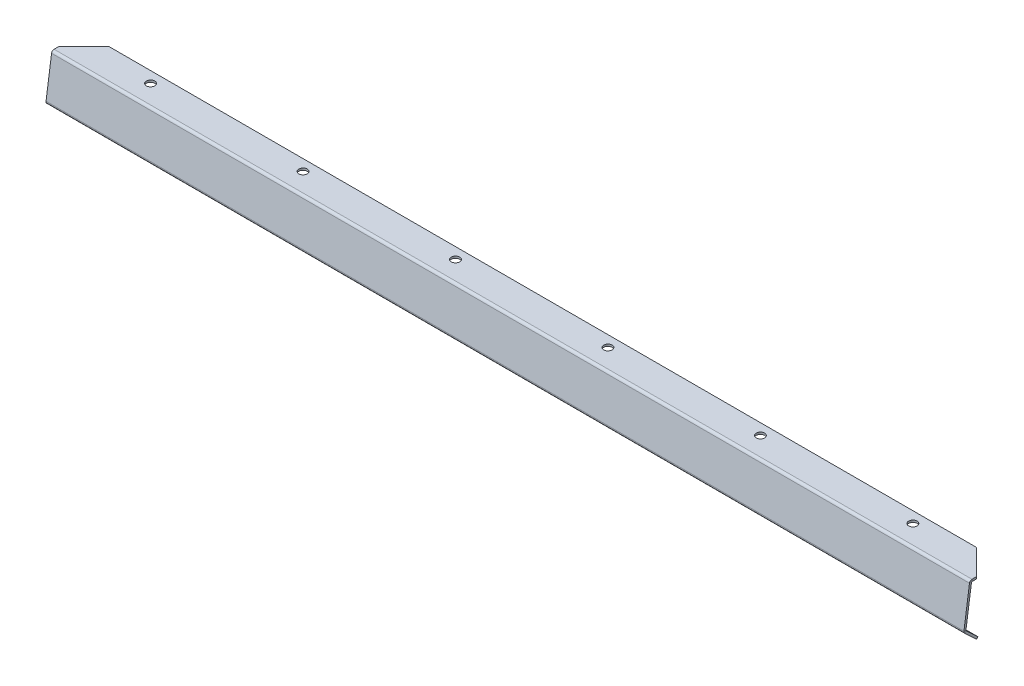
ISO-10303-21;
HEADER;
FILE_DESCRIPTION(('STEP AP214'),'2;1');
FILE_NAME('part.step','',(''),(''),'','','');
FILE_SCHEMA(('AUTOMOTIVE_DESIGN { 1 0 10303 214 1 1 1 1 }'));
ENDSEC;
DATA;
#1=APPLICATION_CONTEXT('core data for automotive mechanical design processes');
#2=APPLICATION_PROTOCOL_DEFINITION('international standard','automotive_design',2000,#1);
#3=PRODUCT_CONTEXT('',#1,'mechanical');
#4=PRODUCT('Part','Part','',(#3));
#5=PRODUCT_RELATED_PRODUCT_CATEGORY('part','',(#4));
#6=PRODUCT_DEFINITION_FORMATION('','',#4);
#7=PRODUCT_DEFINITION_CONTEXT('part definition',#1,'design');
#8=PRODUCT_DEFINITION('design','',#6,#7);
#9=PRODUCT_DEFINITION_SHAPE('','',#8);
#10=(LENGTH_UNIT() NAMED_UNIT(*) SI_UNIT(.MILLI.,.METRE.));
#11=(NAMED_UNIT(*) PLANE_ANGLE_UNIT() SI_UNIT($,.RADIAN.));
#12=(NAMED_UNIT(*) SI_UNIT($,.STERADIAN.) SOLID_ANGLE_UNIT());
#13=UNCERTAINTY_MEASURE_WITH_UNIT(LENGTH_MEASURE(1.E-05),#10,'distance_accuracy_value','');
#14=(GEOMETRIC_REPRESENTATION_CONTEXT(3) GLOBAL_UNCERTAINTY_ASSIGNED_CONTEXT((#13)) GLOBAL_UNIT_ASSIGNED_CONTEXT((#10,
#11,#12)) REPRESENTATION_CONTEXT('',''));
#15=CARTESIAN_POINT('',(0.,0.,0.));
#16=DIRECTION('',(0.,0.,1.));
#17=DIRECTION('',(1.,0.,0.));
#18=AXIS2_PLACEMENT_3D('',#15,#16,#17);
#19=CARTESIAN_POINT('',(-229.4001,0.,10.4394));
#20=DIRECTION('',(0.,1.,0.));
#21=DIRECTION('',(0.,0.,1.));
#22=AXIS2_PLACEMENT_3D('',#19,#20,#21);
#23=PLANE('',#22);
#24=CARTESIAN_POINT('',(38.1,0.,0.));
#25=DIRECTION('',(0.,1.,0.));
#26=DIRECTION('',(0.,0.,-1.));
#27=AXIS2_PLACEMENT_3D('',#24,#25,#26);
#28=CIRCLE('',#27,2.1082);
#29=CARTESIAN_POINT('',(38.1,0.,-2.1082));
#30=VERTEX_POINT('',#29);
#31=EDGE_CURVE('E254',#30,#30,#28,.T.);
#32=ORIENTED_EDGE('',*,*,#31,.F.);
#33=EDGE_LOOP('',(#32));
#34=FACE_BOUND('',#33,.T.);
#35=CARTESIAN_POINT('',(114.3,0.,5.3210206423307E-13));
#36=DIRECTION('',(0.,1.,0.));
#37=DIRECTION('',(0.,0.,-1.));
#38=AXIS2_PLACEMENT_3D('',#35,#36,#37);
#39=CIRCLE('',#38,2.1082);
#40=CARTESIAN_POINT('',(114.3,0.,-2.10819999999947));
#41=VERTEX_POINT('',#40);
#42=EDGE_CURVE('E244',#41,#41,#39,.T.);
#43=ORIENTED_EDGE('',*,*,#42,.F.);
#44=EDGE_LOOP('',(#43));
#45=FACE_BOUND('',#44,.T.);
#46=CARTESIAN_POINT('',(190.5,0.,1.06420412846614E-12));
#47=DIRECTION('',(0.,1.,0.));
#48=DIRECTION('',(0.,0.,-1.));
#49=AXIS2_PLACEMENT_3D('',#46,#47,#48);
#50=CIRCLE('',#49,2.10820000000002);
#51=CARTESIAN_POINT('',(190.5,0.,-2.10819999999895));
#52=VERTEX_POINT('',#51);
#53=EDGE_CURVE('E241',#52,#52,#50,.T.);
#54=ORIENTED_EDGE('',*,*,#53,.F.);
#55=EDGE_LOOP('',(#54));
#56=FACE_BOUND('',#55,.T.);
#57=CARTESIAN_POINT('',(-190.5,0.,1.06420412846614E-12));
#58=DIRECTION('',(0.,1.,0.));
#59=DIRECTION('',(0.,0.,1.));
#60=AXIS2_PLACEMENT_3D('',#57,#58,#59);
#61=CIRCLE('',#60,2.10820000000002);
#62=CARTESIAN_POINT('',(-190.5,0.,2.10820000000108));
#63=VERTEX_POINT('',#62);
#64=EDGE_CURVE('E238',#63,#63,#61,.T.);
#65=ORIENTED_EDGE('',*,*,#64,.F.);
#66=EDGE_LOOP('',(#65));
#67=FACE_BOUND('',#66,.T.);
#68=CARTESIAN_POINT('',(-114.3,0.,5.3210206423307E-13));
#69=DIRECTION('',(0.,1.,0.));
#70=DIRECTION('',(0.,0.,1.));
#71=AXIS2_PLACEMENT_3D('',#68,#69,#70);
#72=CIRCLE('',#71,2.1082);
#73=CARTESIAN_POINT('',(-114.3,0.,2.10820000000053));
#74=VERTEX_POINT('',#73);
#75=EDGE_CURVE('E234',#74,#74,#72,.T.);
#76=ORIENTED_EDGE('',*,*,#75,.F.);
#77=EDGE_LOOP('',(#76));
#78=FACE_BOUND('',#77,.T.);
#79=CARTESIAN_POINT('',(-38.1,0.,0.));
#80=DIRECTION('',(0.,1.,0.));
#81=DIRECTION('',(0.,0.,1.));
#82=AXIS2_PLACEMENT_3D('',#79,#80,#81);
#83=CIRCLE('',#82,2.1082);
#84=CARTESIAN_POINT('',(-38.1,0.,2.1082));
#85=VERTEX_POINT('',#84);
#86=EDGE_CURVE('E230',#85,#85,#83,.T.);
#87=ORIENTED_EDGE('',*,*,#86,.F.);
#88=EDGE_LOOP('',(#87));
#89=FACE_BOUND('',#88,.T.);
#90=DIRECTION('',(0.,0.,1.));
#91=VECTOR('',#90,1.);
#92=CARTESIAN_POINT('',(229.4001,0.,10.4394));
#93=LINE('',#92,#91);
#94=CARTESIAN_POINT('',(229.4001,0.,7.1374000000002));
#95=VERTEX_POINT('',#94);
#96=CARTESIAN_POINT('',(229.4001,0.,9.33821053030135));
#97=VERTEX_POINT('',#96);
#98=EDGE_CURVE('E161',#95,#97,#93,.T.);
#99=ORIENTED_EDGE('',*,*,#98,.F.);
#100=DIRECTION('',(0.707106781186544,0.,0.707106781186551));
#101=VECTOR('',#100,1.);
#102=CARTESIAN_POINT('',(215.810037106983,0.,-6.45266289301725));
#103=LINE('',#102,#101);
#104=CARTESIAN_POINT('',(216.7001,0.,-5.56260000000001));
#105=VERTEX_POINT('',#104);
#106=EDGE_CURVE('E56',#105,#95,#103,.T.);
#107=ORIENTED_EDGE('',*,*,#106,.F.);
#108=DIRECTION('',(1.,0.,0.));
#109=VECTOR('',#108,1.);
#110=CARTESIAN_POINT('',(-229.4001,0.,-5.5626));
#111=LINE('',#110,#109);
#112=CARTESIAN_POINT('',(-216.7001,0.,-5.5626));
#113=VERTEX_POINT('',#112);
#114=EDGE_CURVE('E193',#113,#105,#111,.T.);
#115=ORIENTED_EDGE('',*,*,#114,.F.);
#116=DIRECTION('',(0.707106781186544,0.,-0.707106781186551));
#117=VECTOR('',#116,1.);
#118=CARTESIAN_POINT('',(-215.810037106983,0.,-6.45266289301725));
#119=LINE('',#118,#117);
#120=CARTESIAN_POINT('',(-229.4001,0.,7.13740000000013));
#121=VERTEX_POINT('',#120);
#122=EDGE_CURVE('E444',#121,#113,#119,.T.);
#123=ORIENTED_EDGE('',*,*,#122,.F.);
#124=DIRECTION('',(0.,0.,1.));
#125=VECTOR('',#124,1.);
#126=CARTESIAN_POINT('',(-229.4001,0.,10.4394));
#127=LINE('',#126,#125);
#128=CARTESIAN_POINT('',(-229.4001,0.,9.33821053030135));
#129=VERTEX_POINT('',#128);
#130=EDGE_CURVE('E281',#121,#129,#127,.T.);
#131=ORIENTED_EDGE('',*,*,#130,.T.);
#132=DIRECTION('',(1.,0.,0.));
#133=VECTOR('',#132,1.);
#134=CARTESIAN_POINT('',(-229.4001,0.,9.33821053030135));
#135=LINE('',#134,#133);
#136=EDGE_CURVE('E190',#129,#97,#135,.T.);
#137=ORIENTED_EDGE('',*,*,#136,.T.);
#138=EDGE_LOOP('',(#99,#107,#115,#123,#131,#137));
#139=FACE_BOUND('',#138,.T.);
#140=ADVANCED_FACE('F39',(#34,#45,#56,#67,#78,#89,#139),#23,.T.);
#141=CARTESIAN_POINT('',(-229.4001,0.,-5.5626));
#142=DIRECTION('',(0.,0.,1.));
#143=DIRECTION('',(0.,-1.,0.));
#144=AXIS2_PLACEMENT_3D('',#141,#142,#143);
#145=PLANE('',#144);
#146=DIRECTION('',(0.,1.,0.));
#147=VECTOR('',#146,1.);
#148=CARTESIAN_POINT('',(216.7001,0.,-5.56260000000001));
#149=LINE('',#148,#147);
#150=CARTESIAN_POINT('',(216.7001,-1.016,-5.56260000000001));
#151=VERTEX_POINT('',#150);
#152=EDGE_CURVE('E146',#105,#151,#149,.F.);
#153=ORIENTED_EDGE('',*,*,#152,.T.);
#154=DIRECTION('',(1.,0.,0.));
#155=VECTOR('',#154,1.);
#156=CARTESIAN_POINT('',(-229.4001,-1.016,-5.5626));
#157=LINE('',#156,#155);
#158=CARTESIAN_POINT('',(-216.7001,-1.016,-5.5626));
#159=VERTEX_POINT('',#158);
#160=EDGE_CURVE('E155',#159,#151,#157,.T.);
#161=ORIENTED_EDGE('',*,*,#160,.F.);
#162=DIRECTION('',(0.,-1.,0.));
#163=VECTOR('',#162,1.);
#164=CARTESIAN_POINT('',(-216.7001,-1.016,-5.5626));
#165=LINE('',#164,#163);
#166=EDGE_CURVE('E449',#159,#113,#165,.F.);
#167=ORIENTED_EDGE('',*,*,#166,.T.);
#168=ORIENTED_EDGE('',*,*,#114,.T.);
#169=EDGE_LOOP('',(#153,#161,#167,#168));
#170=FACE_BOUND('',#169,.T.);
#171=ADVANCED_FACE('F371',(#170),#145,.F.);
#172=CARTESIAN_POINT('',(-229.4001,-1.016,10.4394));
#173=DIRECTION('',(0.,1.,0.));
#174=DIRECTION('',(0.,0.,1.));
#175=AXIS2_PLACEMENT_3D('',#172,#173,#174);
#176=PLANE('',#175);
#177=CARTESIAN_POINT('',(38.1,-1.016,0.));
#178=DIRECTION('',(0.,1.,0.));
#179=DIRECTION('',(0.,0.,1.));
#180=AXIS2_PLACEMENT_3D('',#177,#178,#179);
#181=CIRCLE('',#180,2.1082);
#182=CARTESIAN_POINT('',(38.1,-1.016,2.1082));
#183=VERTEX_POINT('',#182);
#184=EDGE_CURVE('E43',#183,#183,#181,.T.);
#185=ORIENTED_EDGE('',*,*,#184,.T.);
#186=EDGE_LOOP('',(#185));
#187=FACE_BOUND('',#186,.T.);
#188=CARTESIAN_POINT('',(114.3,-1.016,5.3210206423307E-13));
#189=DIRECTION('',(0.,1.,0.));
#190=DIRECTION('',(0.,0.,1.));
#191=AXIS2_PLACEMENT_3D('',#188,#189,#190);
#192=CIRCLE('',#191,2.1082);
#193=CARTESIAN_POINT('',(114.3,-1.016,2.10820000000053));
#194=VERTEX_POINT('',#193);
#195=EDGE_CURVE('E242',#194,#194,#192,.T.);
#196=ORIENTED_EDGE('',*,*,#195,.T.);
#197=EDGE_LOOP('',(#196));
#198=FACE_BOUND('',#197,.T.);
#199=CARTESIAN_POINT('',(190.5,-1.016,1.06420412846614E-12));
#200=DIRECTION('',(0.,1.,0.));
#201=DIRECTION('',(0.,0.,1.));
#202=AXIS2_PLACEMENT_3D('',#199,#200,#201);
#203=CIRCLE('',#202,2.10820000000002);
#204=CARTESIAN_POINT('',(190.5,-1.016,2.10820000000108));
#205=VERTEX_POINT('',#204);
#206=EDGE_CURVE('E239',#205,#205,#203,.T.);
#207=ORIENTED_EDGE('',*,*,#206,.T.);
#208=EDGE_LOOP('',(#207));
#209=FACE_BOUND('',#208,.T.);
#210=CARTESIAN_POINT('',(-190.5,-1.016,1.06420412846614E-12));
#211=DIRECTION('',(0.,1.,0.));
#212=DIRECTION('',(0.,0.,1.));
#213=AXIS2_PLACEMENT_3D('',#210,#211,#212);
#214=CIRCLE('',#213,2.10820000000002);
#215=CARTESIAN_POINT('',(-190.5,-1.016,2.10820000000108));
#216=VERTEX_POINT('',#215);
#217=EDGE_CURVE('E235',#216,#216,#214,.T.);
#218=ORIENTED_EDGE('',*,*,#217,.T.);
#219=EDGE_LOOP('',(#218));
#220=FACE_BOUND('',#219,.T.);
#221=CARTESIAN_POINT('',(-114.3,-1.016,5.3210206423307E-13));
#222=DIRECTION('',(0.,1.,0.));
#223=DIRECTION('',(0.,0.,1.));
#224=AXIS2_PLACEMENT_3D('',#221,#222,#223);
#225=CIRCLE('',#224,2.1082);
#226=CARTESIAN_POINT('',(-114.3,-1.016,2.10820000000053));
#227=VERTEX_POINT('',#226);
#228=EDGE_CURVE('E231',#227,#227,#225,.T.);
#229=ORIENTED_EDGE('',*,*,#228,.T.);
#230=EDGE_LOOP('',(#229));
#231=FACE_BOUND('',#230,.T.);
#232=CARTESIAN_POINT('',(-38.1,-1.016,0.));
#233=DIRECTION('',(0.,1.,0.));
#234=DIRECTION('',(0.,0.,1.));
#235=AXIS2_PLACEMENT_3D('',#232,#233,#234);
#236=CIRCLE('',#235,2.1082);
#237=CARTESIAN_POINT('',(-38.1,-1.016,2.1082));
#238=VERTEX_POINT('',#237);
#239=EDGE_CURVE('E226',#238,#238,#236,.T.);
#240=ORIENTED_EDGE('',*,*,#239,.T.);
#241=EDGE_LOOP('',(#240));
#242=FACE_BOUND('',#241,.T.);
#243=DIRECTION('',(0.707106781186544,0.,0.707106781186551));
#244=VECTOR('',#243,1.);
#245=CARTESIAN_POINT('',(215.810037106983,-1.016,-6.45266289301725));
#246=LINE('',#245,#244);
#247=CARTESIAN_POINT('',(229.4001,-1.016,7.13740000000009));
#248=VERTEX_POINT('',#247);
#249=EDGE_CURVE('E141',#151,#248,#246,.T.);
#250=ORIENTED_EDGE('',*,*,#249,.T.);
#251=DIRECTION('',(0.,0.,-1.));
#252=VECTOR('',#251,1.);
#253=CARTESIAN_POINT('',(229.4001,-1.016,10.4394));
#254=LINE('',#253,#252);
#255=CARTESIAN_POINT('',(229.4001,-1.016,9.33821053030135));
#256=VERTEX_POINT('',#255);
#257=EDGE_CURVE('E152',#248,#256,#254,.F.);
#258=ORIENTED_EDGE('',*,*,#257,.T.);
#259=DIRECTION('',(1.,0.,0.));
#260=VECTOR('',#259,1.);
#261=CARTESIAN_POINT('',(-229.4001,-1.016,9.33821053030135));
#262=LINE('',#261,#260);
#263=CARTESIAN_POINT('',(-229.4001,-1.016,9.33821053030135));
#264=VERTEX_POINT('',#263);
#265=EDGE_CURVE('E197',#264,#256,#262,.T.);
#266=ORIENTED_EDGE('',*,*,#265,.F.);
#267=DIRECTION('',(0.,0.,-1.));
#268=VECTOR('',#267,1.);
#269=CARTESIAN_POINT('',(-229.4001,-1.016,10.4394));
#270=LINE('',#269,#268);
#271=CARTESIAN_POINT('',(-229.4001,-1.016,7.13740000000013));
#272=VERTEX_POINT('',#271);
#273=EDGE_CURVE('E279',#272,#264,#270,.F.);
#274=ORIENTED_EDGE('',*,*,#273,.F.);
#275=DIRECTION('',(0.707106781186544,0.,-0.707106781186551));
#276=VECTOR('',#275,1.);
#277=CARTESIAN_POINT('',(-215.810037106983,-1.016,-6.45266289301725));
#278=LINE('',#277,#276);
#279=EDGE_CURVE('E64',#272,#159,#278,.T.);
#280=ORIENTED_EDGE('',*,*,#279,.T.);
#281=ORIENTED_EDGE('',*,*,#160,.T.);
#282=EDGE_LOOP('',(#250,#258,#266,#274,#280,#281));
#283=FACE_BOUND('',#282,.T.);
#284=ADVANCED_FACE('F150',(#187,#198,#209,#220,#231,#242,#283),#176,.F.);
#285=CARTESIAN_POINT('',(229.4001,-1.23401666666667,9.58964879254921));
#286=DIRECTION('',(1.,0.,0.));
#287=DIRECTION('',(0.,0.,-1.));
#288=AXIS2_PLACEMENT_3D('',#285,#286,#287);
#289=PLANE('',#288);
#290=ORIENTED_EDGE('',*,*,#257,.F.);
#291=DIRECTION('',(0.,1.,0.));
#292=VECTOR('',#291,1.);
#293=CARTESIAN_POINT('',(229.4001,0.,7.13740000000009));
#294=LINE('',#293,#292);
#295=EDGE_CURVE('E138',#95,#248,#294,.F.);
#296=ORIENTED_EDGE('',*,*,#295,.F.);
#297=ORIENTED_EDGE('',*,*,#98,.T.);
#298=DIRECTION('',(0.,-1.,0.));
#299=VECTOR('',#298,1.);
#300=CARTESIAN_POINT('',(229.4001,0.,9.33821053030135));
#301=LINE('',#300,#299);
#302=EDGE_CURVE('E159',#97,#256,#301,.T.);
#303=ORIENTED_EDGE('',*,*,#302,.T.);
#304=EDGE_LOOP('',(#290,#296,#297,#303));
#305=FACE_BOUND('',#304,.T.);
#306=ADVANCED_FACE('F157',(#305),#289,.T.);
#307=CARTESIAN_POINT('',(-229.4001,-20.6462783226156,12.1111500002489));
#308=DIRECTION('',(1.,0.,0.));
#309=DIRECTION('',(0.,0.,-1.));
#310=AXIS2_PLACEMENT_3D('',#307,#308,#309);
#311=PLANE('',#310);
#312=DIRECTION('',(0.,-1.,0.));
#313=VECTOR('',#312,1.);
#314=CARTESIAN_POINT('',(-229.4001,-1.016,7.13740000000013));
#315=LINE('',#314,#313);
#316=EDGE_CURVE('E446',#272,#121,#315,.F.);
#317=ORIENTED_EDGE('',*,*,#316,.F.);
#318=ORIENTED_EDGE('',*,*,#273,.T.);
#319=DIRECTION('',(0.,1.,0.));
#320=VECTOR('',#319,1.);
#321=CARTESIAN_POINT('',(-229.4001,-1.016,9.33821053030135));
#322=LINE('',#321,#320);
#323=EDGE_CURVE('E48',#264,#129,#322,.T.);
#324=ORIENTED_EDGE('',*,*,#323,.T.);
#325=ORIENTED_EDGE('',*,*,#130,.F.);
#326=EDGE_LOOP('',(#317,#318,#324,#325));
#327=FACE_BOUND('',#326,.T.);
#328=ADVANCED_FACE('F407',(#327),#311,.F.);
#329=CARTESIAN_POINT('',(-229.4001,-1.09008333333333,10.5954018415406));
#330=DIRECTION('',(-1.,0.,0.));
#331=DIRECTION('',(0.,0.,1.));
#332=AXIS2_PLACEMENT_3D('',#329,#330,#331);
#333=PLANE('',#332);
#334=DIRECTION('',(0.,-0.141666666666667,-0.98991441829865));
#335=VECTOR('',#334,1.);
#336=CARTESIAN_POINT('',(-229.4001,-1.09008333333333,10.5954018415406));
#337=LINE('',#336,#335);
#338=CARTESIAN_POINT('',(-229.4001,-1.09008333333333,10.5954018415406));
#339=VERTEX_POINT('',#338);
#340=CARTESIAN_POINT('',(-229.4001,-1.23401666666667,9.58964879254921));
#341=VERTEX_POINT('',#340);
#342=EDGE_CURVE('E11',#339,#341,#337,.T.);
#343=ORIENTED_EDGE('',*,*,#342,.F.);
#344=CARTESIAN_POINT('',(-229.4001,-1.27,9.33821053030135));
#345=DIRECTION('',(-1.,0.,0.));
#346=DIRECTION('',(0.,0.,1.));
#347=AXIS2_PLACEMENT_3D('',#344,#345,#346);
#348=CIRCLE('',#347,1.27);
#349=EDGE_CURVE('E283',#129,#339,#348,.F.);
#350=ORIENTED_EDGE('',*,*,#349,.F.);
#351=ORIENTED_EDGE('',*,*,#323,.F.);
#352=CARTESIAN_POINT('',(-229.4001,-1.27,9.33821053030135));
#353=DIRECTION('',(1.,0.,0.));
#354=DIRECTION('',(0.,0.,-1.));
#355=AXIS2_PLACEMENT_3D('',#352,#353,#354);
#356=CIRCLE('',#355,0.254);
#357=EDGE_CURVE('E276',#264,#341,#356,.T.);
#358=ORIENTED_EDGE('',*,*,#357,.T.);
#359=EDGE_LOOP('',(#343,#350,#351,#358));
#360=FACE_BOUND('',#359,.T.);
#361=ADVANCED_FACE('F41',(#360),#333,.T.);
#362=CARTESIAN_POINT('',(-229.4001,-1.016,9.33821053030135));
#363=DIRECTION('',(-1.,0.,0.));
#364=DIRECTION('',(0.,0.,1.));
#365=AXIS2_PLACEMENT_3D('',#362,#363,#364);
#366=PLANE('',#365);
#367=DIRECTION('',(0.,-0.989914418298651,0.141666666666667));
#368=VECTOR('',#367,1.);
#369=CARTESIAN_POINT('',(-229.4001,0.,10.4394));
#370=LINE('',#369,#368);
#371=CARTESIAN_POINT('',(-229.4001,-20.4663616559489,13.3683413114882));
#372=VERTEX_POINT('',#371);
#373=EDGE_CURVE('E286',#339,#372,#370,.T.);
#374=ORIENTED_EDGE('',*,*,#373,.F.);
#375=ORIENTED_EDGE('',*,*,#342,.T.);
#376=DIRECTION('',(0.,-0.98991441829865,0.141666666666667));
#377=VECTOR('',#376,1.);
#378=CARTESIAN_POINT('',(-229.4001,-0.143933333333333,9.43364695100857));
#379=LINE('',#378,#377);
#380=CARTESIAN_POINT('',(-229.4001,-20.6102949892822,12.3625882624968));
#381=VERTEX_POINT('',#380);
#382=EDGE_CURVE('E273',#341,#381,#379,.T.);
#383=ORIENTED_EDGE('',*,*,#382,.T.);
#384=DIRECTION('',(0.,0.141666666666658,0.989914418298652));
#385=VECTOR('',#384,1.);
#386=CARTESIAN_POINT('',(-229.4001,-20.6102949892822,12.3625882624968));
#387=LINE('',#386,#385);
#388=EDGE_CURVE('E217',#381,#372,#387,.T.);
#389=ORIENTED_EDGE('',*,*,#388,.T.);
#390=EDGE_LOOP('',(#374,#375,#383,#389));
#391=FACE_BOUND('',#390,.T.);
#392=ADVANCED_FACE('F343',(#391),#366,.T.);
#393=CARTESIAN_POINT('',(229.4001,0.,9.33821053030135));
#394=DIRECTION('',(1.,0.,0.));
#395=DIRECTION('',(0.,0.,-1.));
#396=AXIS2_PLACEMENT_3D('',#393,#394,#395);
#397=PLANE('',#396);
#398=ORIENTED_EDGE('',*,*,#302,.F.);
#399=CARTESIAN_POINT('',(229.4001,-1.27,9.33821053030135));
#400=DIRECTION('',(-1.,0.,0.));
#401=DIRECTION('',(0.,0.,1.));
#402=AXIS2_PLACEMENT_3D('',#399,#400,#401);
#403=CIRCLE('',#402,1.27);
#404=CARTESIAN_POINT('',(229.4001,-1.09008333333333,10.5954018415406));
#405=VERTEX_POINT('',#404);
#406=EDGE_CURVE('E164',#97,#405,#403,.F.);
#407=ORIENTED_EDGE('',*,*,#406,.T.);
#408=DIRECTION('',(0.,0.141666666666667,0.98991441829865));
#409=VECTOR('',#408,1.);
#410=CARTESIAN_POINT('',(229.4001,-1.23401666666667,9.58964879254921));
#411=LINE('',#410,#409);
#412=CARTESIAN_POINT('',(229.4001,-1.23401666666667,9.58964879254921));
#413=VERTEX_POINT('',#412);
#414=EDGE_CURVE('E221',#413,#405,#411,.T.);
#415=ORIENTED_EDGE('',*,*,#414,.F.);
#416=CARTESIAN_POINT('',(229.4001,-1.27,9.33821053030135));
#417=DIRECTION('',(1.,0.,0.));
#418=DIRECTION('',(0.,0.,-1.));
#419=AXIS2_PLACEMENT_3D('',#416,#417,#418);
#420=CIRCLE('',#419,0.254);
#421=EDGE_CURVE('E162',#256,#413,#420,.T.);
#422=ORIENTED_EDGE('',*,*,#421,.F.);
#423=EDGE_LOOP('',(#398,#407,#415,#422));
#424=FACE_BOUND('',#423,.T.);
#425=ADVANCED_FACE('F353',(#424),#397,.T.);
#426=CARTESIAN_POINT('',(-229.4001,-21.5729131947727,12.9796244176627));
#427=DIRECTION('',(-1.,0.,0.));
#428=DIRECTION('',(0.,0.,1.));
#429=AXIS2_PLACEMENT_3D('',#426,#427,#428);
#430=PLANE('',#429);
#431=DIRECTION('',(0.,0.729633757604092,-0.683838123947863));
#432=VECTOR('',#431,1.);
#433=CARTESIAN_POINT('',(-229.4001,-21.5729131947727,12.9796244176627));
#434=LINE('',#433,#432);
#435=CARTESIAN_POINT('',(-229.4001,-21.5729131947727,12.9796244176627));
#436=VERTEX_POINT('',#435);
#437=CARTESIAN_POINT('',(-229.4001,-20.831605297047,12.2848448837317));
#438=VERTEX_POINT('',#437);
#439=EDGE_CURVE('E219',#436,#438,#434,.T.);
#440=ORIENTED_EDGE('',*,*,#439,.F.);
#441=CARTESIAN_POINT('',(-229.4001,-20.6462783226156,12.1111500002489));
#442=DIRECTION('',(-1.,0.,0.));
#443=DIRECTION('',(0.,0.,1.));
#444=AXIS2_PLACEMENT_3D('',#441,#442,#443);
#445=CIRCLE('',#444,1.27);
#446=EDGE_CURVE('E213',#372,#436,#445,.F.);
#447=ORIENTED_EDGE('',*,*,#446,.F.);
#448=ORIENTED_EDGE('',*,*,#388,.F.);
#449=CARTESIAN_POINT('',(-229.4001,-20.6462783226156,12.1111500002489));
#450=DIRECTION('',(1.,0.,0.));
#451=DIRECTION('',(0.,0.,-1.));
#452=AXIS2_PLACEMENT_3D('',#449,#450,#451);
#453=CIRCLE('',#452,0.254);
#454=EDGE_CURVE('E270',#381,#438,#453,.T.);
#455=ORIENTED_EDGE('',*,*,#454,.T.);
#456=EDGE_LOOP('',(#440,#447,#448,#455));
#457=FACE_BOUND('',#456,.T.);
#458=ADVANCED_FACE('F340',(#457),#430,.T.);
#459=CARTESIAN_POINT('',(-229.4001,-20.6102949892822,12.3625882624968));
#460=DIRECTION('',(-1.,0.,0.));
#461=DIRECTION('',(0.,0.,1.));
#462=AXIS2_PLACEMENT_3D('',#459,#460,#461);
#463=PLANE('',#462);
#464=DIRECTION('',(0.,-0.683838123947864,-0.729633757604091));
#465=VECTOR('',#464,1.);
#466=CARTESIAN_POINT('',(-229.4001,-21.12081402882,13.462));
#467=LINE('',#466,#465);
#468=CARTESIAN_POINT('',(-229.4001,-27.1480264856717,7.03115398722906));
#469=VERTEX_POINT('',#468);
#470=EDGE_CURVE('E179',#436,#469,#467,.T.);
#471=ORIENTED_EDGE('',*,*,#470,.F.);
#472=ORIENTED_EDGE('',*,*,#439,.T.);
#473=DIRECTION('',(0.,-0.683838123947864,-0.729633757604091));
#474=VECTOR('',#473,1.);
#475=CARTESIAN_POINT('',(-229.4001,-20.3795061310942,12.767220466069));
#476=LINE('',#475,#474);
#477=CARTESIAN_POINT('',(-229.4001,-26.4067185879459,6.33637445329803));
#478=VERTEX_POINT('',#477);
#479=EDGE_CURVE('E268',#438,#478,#476,.T.);
#480=ORIENTED_EDGE('',*,*,#479,.T.);
#481=DIRECTION('',(0.,-0.729633757604092,0.683838123947863));
#482=VECTOR('',#481,1.);
#483=CARTESIAN_POINT('',(-229.4001,-26.4067185879459,6.33637445329803));
#484=LINE('',#483,#482);
#485=EDGE_CURVE('E266',#478,#469,#484,.T.);
#486=ORIENTED_EDGE('',*,*,#485,.T.);
#487=EDGE_LOOP('',(#471,#472,#480,#486));
#488=FACE_BOUND('',#487,.T.);
#489=ADVANCED_FACE('F338',(#488),#463,.T.);
#490=CARTESIAN_POINT('',(229.4001,-20.4663616559489,13.3683413114882));
#491=DIRECTION('',(1.,0.,0.));
#492=DIRECTION('',(0.,0.,-1.));
#493=AXIS2_PLACEMENT_3D('',#490,#491,#492);
#494=PLANE('',#493);
#495=DIRECTION('',(0.,-0.141666666666658,-0.989914418298652));
#496=VECTOR('',#495,1.);
#497=CARTESIAN_POINT('',(229.4001,-20.4663616559489,13.3683413114882));
#498=LINE('',#497,#496);
#499=CARTESIAN_POINT('',(229.4001,-20.4663616559489,13.3683413114882));
#500=VERTEX_POINT('',#499);
#501=CARTESIAN_POINT('',(229.4001,-20.6102949892822,12.3625882624968));
#502=VERTEX_POINT('',#501);
#503=EDGE_CURVE('E215',#500,#502,#498,.T.);
#504=ORIENTED_EDGE('',*,*,#503,.F.);
#505=CARTESIAN_POINT('',(229.4001,-20.6462783226156,12.1111500002489));
#506=DIRECTION('',(-1.,0.,0.));
#507=DIRECTION('',(0.,0.,1.));
#508=AXIS2_PLACEMENT_3D('',#505,#506,#507);
#509=CIRCLE('',#508,1.27);
#510=CARTESIAN_POINT('',(229.4001,-21.5729131947727,12.9796244176627));
#511=VERTEX_POINT('',#510);
#512=EDGE_CURVE('E176',#500,#511,#509,.F.);
#513=ORIENTED_EDGE('',*,*,#512,.T.);
#514=DIRECTION('',(0.,-0.729633757604092,0.683838123947863));
#515=VECTOR('',#514,1.);
#516=CARTESIAN_POINT('',(229.4001,-20.831605297047,12.2848448837317));
#517=LINE('',#516,#515);
#518=CARTESIAN_POINT('',(229.4001,-20.831605297047,12.2848448837317));
#519=VERTEX_POINT('',#518);
#520=EDGE_CURVE('E183',#519,#511,#517,.T.);
#521=ORIENTED_EDGE('',*,*,#520,.F.);
#522=CARTESIAN_POINT('',(229.4001,-20.6462783226156,12.1111500002489));
#523=DIRECTION('',(1.,0.,0.));
#524=DIRECTION('',(0.,0.,-1.));
#525=AXIS2_PLACEMENT_3D('',#522,#523,#524);
#526=CIRCLE('',#525,0.254);
#527=EDGE_CURVE('E298',#502,#519,#526,.T.);
#528=ORIENTED_EDGE('',*,*,#527,.F.);
#529=EDGE_LOOP('',(#504,#513,#521,#528));
#530=FACE_BOUND('',#529,.T.);
#531=ADVANCED_FACE('F314',(#530),#494,.T.);
#532=CARTESIAN_POINT('',(229.4001,-20.831605297047,12.2848448837317));
#533=DIRECTION('',(1.,0.,0.));
#534=DIRECTION('',(0.,0.,-1.));
#535=AXIS2_PLACEMENT_3D('',#532,#533,#534);
#536=PLANE('',#535);
#537=DIRECTION('',(0.,-0.989914418298651,0.141666666666667));
#538=VECTOR('',#537,1.);
#539=CARTESIAN_POINT('',(229.4001,0.,10.4394));
#540=LINE('',#539,#538);
#541=EDGE_CURVE('E173',#405,#500,#540,.T.);
#542=ORIENTED_EDGE('',*,*,#541,.T.);
#543=ORIENTED_EDGE('',*,*,#503,.T.);
#544=DIRECTION('',(0.,-0.98991441829865,0.141666666666667));
#545=VECTOR('',#544,1.);
#546=CARTESIAN_POINT('',(229.4001,-0.143933333333333,9.43364695100857));
#547=LINE('',#546,#545);
#548=EDGE_CURVE('E167',#413,#502,#547,.T.);
#549=ORIENTED_EDGE('',*,*,#548,.F.);
#550=ORIENTED_EDGE('',*,*,#414,.T.);
#551=EDGE_LOOP('',(#542,#543,#549,#550));
#552=FACE_BOUND('',#551,.T.);
#553=ADVANCED_FACE('F355',(#552),#536,.T.);
#554=CARTESIAN_POINT('',(-229.4001,-21.12081402882,13.462));
#555=DIRECTION('',(0.,-0.729633757604091,0.683838123947864));
#556=DIRECTION('',(0.,-0.683838123947864,-0.729633757604091));
#557=AXIS2_PLACEMENT_3D('',#554,#555,#556);
#558=PLANE('',#557);
#559=DIRECTION('',(0.,-0.683838123947864,-0.729633757604091));
#560=VECTOR('',#559,1.);
#561=CARTESIAN_POINT('',(229.4001,-21.12081402882,13.462));
#562=LINE('',#561,#560);
#563=CARTESIAN_POINT('',(229.4001,-27.1480264856717,7.03115398722906));
#564=VERTEX_POINT('',#563);
#565=EDGE_CURVE('E229',#511,#564,#562,.T.);
#566=ORIENTED_EDGE('',*,*,#565,.F.);
#567=DIRECTION('',(1.,0.,0.));
#568=VECTOR('',#567,1.);
#569=CARTESIAN_POINT('',(-229.4001,-21.5729131947727,12.9796244176627));
#570=LINE('',#569,#568);
#571=EDGE_CURVE('E180',#436,#511,#570,.T.);
#572=ORIENTED_EDGE('',*,*,#571,.F.);
#573=ORIENTED_EDGE('',*,*,#470,.T.);
#574=DIRECTION('',(1.,0.,0.));
#575=VECTOR('',#574,1.);
#576=CARTESIAN_POINT('',(-229.4001,-27.1480264856717,7.03115398722906));
#577=LINE('',#576,#575);
#578=EDGE_CURVE('E211',#469,#564,#577,.T.);
#579=ORIENTED_EDGE('',*,*,#578,.T.);
#580=EDGE_LOOP('',(#566,#572,#573,#579));
#581=FACE_BOUND('',#580,.T.);
#582=ADVANCED_FACE('F328',(#581),#558,.T.);
#583=CARTESIAN_POINT('',(-229.4001,-20.6462783226156,12.1111500002489));
#584=DIRECTION('',(1.,0.,0.));
#585=DIRECTION('',(0.,0.,-1.));
#586=AXIS2_PLACEMENT_3D('',#583,#584,#585);
#587=CYLINDRICAL_SURFACE('',#586,1.27);
#588=ORIENTED_EDGE('',*,*,#512,.F.);
#589=DIRECTION('',(1.,0.,0.));
#590=VECTOR('',#589,1.);
#591=CARTESIAN_POINT('',(-229.4001,-20.4663616559489,13.3683413114882));
#592=LINE('',#591,#590);
#593=EDGE_CURVE('E184',#372,#500,#592,.T.);
#594=ORIENTED_EDGE('',*,*,#593,.F.);
#595=ORIENTED_EDGE('',*,*,#446,.T.);
#596=ORIENTED_EDGE('',*,*,#571,.T.);
#597=EDGE_LOOP('',(#588,#594,#595,#596));
#598=FACE_BOUND('',#597,.T.);
#599=ADVANCED_FACE('F323',(#598),#587,.T.);
#600=CARTESIAN_POINT('',(-229.4001,0.,10.4394));
#601=DIRECTION('',(0.,0.141666666666667,0.98991441829865));
#602=DIRECTION('',(0.,-0.989914418298651,0.141666666666667));
#603=AXIS2_PLACEMENT_3D('',#600,#601,#602);
#604=PLANE('',#603);
#605=ORIENTED_EDGE('',*,*,#541,.F.);
#606=DIRECTION('',(1.,0.,0.));
#607=VECTOR('',#606,1.);
#608=CARTESIAN_POINT('',(-229.4001,-1.09008333333333,10.5954018415406));
#609=LINE('',#608,#607);
#610=EDGE_CURVE('E187',#339,#405,#609,.T.);
#611=ORIENTED_EDGE('',*,*,#610,.F.);
#612=ORIENTED_EDGE('',*,*,#373,.T.);
#613=ORIENTED_EDGE('',*,*,#593,.T.);
#614=EDGE_LOOP('',(#605,#611,#612,#613));
#615=FACE_BOUND('',#614,.T.);
#616=ADVANCED_FACE('F361',(#615),#604,.T.);
#617=CARTESIAN_POINT('',(-229.4001,-1.27,9.33821053030135));
#618=DIRECTION('',(1.,0.,0.));
#619=DIRECTION('',(0.,0.,-1.));
#620=AXIS2_PLACEMENT_3D('',#617,#618,#619);
#621=CYLINDRICAL_SURFACE('',#620,1.27);
#622=ORIENTED_EDGE('',*,*,#406,.F.);
#623=ORIENTED_EDGE('',*,*,#136,.F.);
#624=ORIENTED_EDGE('',*,*,#349,.T.);
#625=ORIENTED_EDGE('',*,*,#610,.T.);
#626=EDGE_LOOP('',(#622,#623,#624,#625));
#627=FACE_BOUND('',#626,.T.);
#628=ADVANCED_FACE('F358',(#627),#621,.T.);
#629=CARTESIAN_POINT('',(-229.4001,-1.27,9.33821053030135));
#630=DIRECTION('',(1.,0.,0.));
#631=DIRECTION('',(0.,0.,-1.));
#632=AXIS2_PLACEMENT_3D('',#629,#630,#631);
#633=CYLINDRICAL_SURFACE('',#632,0.254);
#634=ORIENTED_EDGE('',*,*,#421,.T.);
#635=DIRECTION('',(1.,0.,0.));
#636=VECTOR('',#635,1.);
#637=CARTESIAN_POINT('',(-229.4001,-1.23401666666667,9.58964879254921));
#638=LINE('',#637,#636);
#639=EDGE_CURVE('E199',#341,#413,#638,.T.);
#640=ORIENTED_EDGE('',*,*,#639,.F.);
#641=ORIENTED_EDGE('',*,*,#357,.F.);
#642=ORIENTED_EDGE('',*,*,#265,.T.);
#643=EDGE_LOOP('',(#634,#640,#641,#642));
#644=FACE_BOUND('',#643,.T.);
#645=ADVANCED_FACE('F350',(#644),#633,.F.);
#646=CARTESIAN_POINT('',(-229.4001,-0.143933333333333,9.43364695100857));
#647=DIRECTION('',(0.,0.141666666666667,0.98991441829865));
#648=DIRECTION('',(0.,-0.98991441829865,0.141666666666667));
#649=AXIS2_PLACEMENT_3D('',#646,#647,#648);
#650=PLANE('',#649);
#651=ORIENTED_EDGE('',*,*,#548,.T.);
#652=DIRECTION('',(1.,0.,0.));
#653=VECTOR('',#652,1.);
#654=CARTESIAN_POINT('',(-229.4001,-20.6102949892822,12.3625882624968));
#655=LINE('',#654,#653);
#656=EDGE_CURVE('E202',#381,#502,#655,.T.);
#657=ORIENTED_EDGE('',*,*,#656,.F.);
#658=ORIENTED_EDGE('',*,*,#382,.F.);
#659=ORIENTED_EDGE('',*,*,#639,.T.);
#660=EDGE_LOOP('',(#651,#657,#658,#659));
#661=FACE_BOUND('',#660,.T.);
#662=ADVANCED_FACE('F304',(#661),#650,.F.);
#663=CARTESIAN_POINT('',(-229.4001,-20.6462783226156,12.1111500002489));
#664=DIRECTION('',(1.,0.,0.));
#665=DIRECTION('',(0.,0.,-1.));
#666=AXIS2_PLACEMENT_3D('',#663,#664,#665);
#667=CYLINDRICAL_SURFACE('',#666,0.254);
#668=ORIENTED_EDGE('',*,*,#527,.T.);
#669=DIRECTION('',(1.,0.,0.));
#670=VECTOR('',#669,1.);
#671=CARTESIAN_POINT('',(-229.4001,-20.831605297047,12.2848448837317));
#672=LINE('',#671,#670);
#673=EDGE_CURVE('E205',#438,#519,#672,.T.);
#674=ORIENTED_EDGE('',*,*,#673,.F.);
#675=ORIENTED_EDGE('',*,*,#454,.F.);
#676=ORIENTED_EDGE('',*,*,#656,.T.);
#677=EDGE_LOOP('',(#668,#674,#675,#676));
#678=FACE_BOUND('',#677,.T.);
#679=ADVANCED_FACE('F311',(#678),#667,.F.);
#680=CARTESIAN_POINT('',(-229.4001,-20.3795061310942,12.767220466069));
#681=DIRECTION('',(0.,-0.729633757604091,0.683838123947864));
#682=DIRECTION('',(0.,-0.683838123947864,-0.729633757604091));
#683=AXIS2_PLACEMENT_3D('',#680,#681,#682);
#684=PLANE('',#683);
#685=DIRECTION('',(0.,-0.683838123947864,-0.729633757604091));
#686=VECTOR('',#685,1.);
#687=CARTESIAN_POINT('',(229.4001,-20.3795061310942,12.767220466069));
#688=LINE('',#687,#686);
#689=CARTESIAN_POINT('',(229.4001,-26.4067185879459,6.33637445329803));
#690=VERTEX_POINT('',#689);
#691=EDGE_CURVE('E296',#519,#690,#688,.T.);
#692=ORIENTED_EDGE('',*,*,#691,.T.);
#693=DIRECTION('',(1.,0.,0.));
#694=VECTOR('',#693,1.);
#695=CARTESIAN_POINT('',(-229.4001,-26.4067185879459,6.33637445329803));
#696=LINE('',#695,#694);
#697=EDGE_CURVE('E208',#478,#690,#696,.T.);
#698=ORIENTED_EDGE('',*,*,#697,.F.);
#699=ORIENTED_EDGE('',*,*,#479,.F.);
#700=ORIENTED_EDGE('',*,*,#673,.T.);
#701=EDGE_LOOP('',(#692,#698,#699,#700));
#702=FACE_BOUND('',#701,.T.);
#703=ADVANCED_FACE('F336',(#702),#684,.F.);
#704=CARTESIAN_POINT('',(-229.4001,-26.4067185879459,6.33637445329803));
#705=DIRECTION('',(0.,0.683838123947863,0.729633757604092));
#706=DIRECTION('',(0.,-0.729633757604092,0.683838123947863));
#707=AXIS2_PLACEMENT_3D('',#704,#705,#706);
#708=PLANE('',#707);
#709=DIRECTION('',(0.,-0.729633757604092,0.683838123947863));
#710=VECTOR('',#709,1.);
#711=CARTESIAN_POINT('',(229.4001,-26.4067185879459,6.33637445329803));
#712=LINE('',#711,#710);
#713=EDGE_CURVE('E293',#690,#564,#712,.T.);
#714=ORIENTED_EDGE('',*,*,#713,.T.);
#715=ORIENTED_EDGE('',*,*,#578,.F.);
#716=ORIENTED_EDGE('',*,*,#485,.F.);
#717=ORIENTED_EDGE('',*,*,#697,.T.);
#718=EDGE_LOOP('',(#714,#715,#716,#717));
#719=FACE_BOUND('',#718,.T.);
#720=ADVANCED_FACE('F332',(#719),#708,.F.);
#721=CARTESIAN_POINT('',(229.4001,-20.6462783226156,12.1111500002489));
#722=DIRECTION('',(1.,0.,0.));
#723=DIRECTION('',(0.,0.,-1.));
#724=AXIS2_PLACEMENT_3D('',#721,#722,#723);
#725=PLANE('',#724);
#726=ORIENTED_EDGE('',*,*,#565,.T.);
#727=ORIENTED_EDGE('',*,*,#713,.F.);
#728=ORIENTED_EDGE('',*,*,#691,.F.);
#729=ORIENTED_EDGE('',*,*,#520,.T.);
#730=EDGE_LOOP('',(#726,#727,#728,#729));
#731=FACE_BOUND('',#730,.T.);
#732=ADVANCED_FACE('F318',(#731),#725,.T.);
#733=CARTESIAN_POINT('',(-38.1,-27.1480264856717,0.));
#734=DIRECTION('',(0.,1.,0.));
#735=DIRECTION('',(0.,0.,1.));
#736=AXIS2_PLACEMENT_3D('',#733,#734,#735);
#737=CYLINDRICAL_SURFACE('',#736,2.1082);
#738=ORIENTED_EDGE('',*,*,#86,.T.);
#739=EDGE_LOOP('',(#738));
#740=FACE_BOUND('',#739,.T.);
#741=ORIENTED_EDGE('',*,*,#239,.F.);
#742=EDGE_LOOP('',(#741));
#743=FACE_BOUND('',#742,.T.);
#744=ADVANCED_FACE('F422',(#740,#743),#737,.F.);
#745=CARTESIAN_POINT('',(-114.3,-27.1480264856717,5.3210206423307E-13));
#746=DIRECTION('',(0.,1.,0.));
#747=DIRECTION('',(0.,0.,1.));
#748=AXIS2_PLACEMENT_3D('',#745,#746,#747);
#749=CYLINDRICAL_SURFACE('',#748,2.1082);
#750=ORIENTED_EDGE('',*,*,#75,.T.);
#751=EDGE_LOOP('',(#750));
#752=FACE_BOUND('',#751,.T.);
#753=ORIENTED_EDGE('',*,*,#228,.F.);
#754=EDGE_LOOP('',(#753));
#755=FACE_BOUND('',#754,.T.);
#756=ADVANCED_FACE('F428',(#752,#755),#749,.F.);
#757=CARTESIAN_POINT('',(-190.5,-27.1480264856717,1.06420412846614E-12));
#758=DIRECTION('',(0.,1.,0.));
#759=DIRECTION('',(0.,0.,1.));
#760=AXIS2_PLACEMENT_3D('',#757,#758,#759);
#761=CYLINDRICAL_SURFACE('',#760,2.10820000000002);
#762=ORIENTED_EDGE('',*,*,#64,.T.);
#763=EDGE_LOOP('',(#762));
#764=FACE_BOUND('',#763,.T.);
#765=ORIENTED_EDGE('',*,*,#217,.F.);
#766=EDGE_LOOP('',(#765));
#767=FACE_BOUND('',#766,.T.);
#768=ADVANCED_FACE('F433',(#764,#767),#761,.F.);
#769=CARTESIAN_POINT('',(190.5,-27.1480264856717,1.06420412846614E-12));
#770=DIRECTION('',(0.,1.,0.));
#771=DIRECTION('',(0.,0.,1.));
#772=AXIS2_PLACEMENT_3D('',#769,#770,#771);
#773=CYLINDRICAL_SURFACE('',#772,2.10820000000002);
#774=ORIENTED_EDGE('',*,*,#53,.T.);
#775=EDGE_LOOP('',(#774));
#776=FACE_BOUND('',#775,.T.);
#777=ORIENTED_EDGE('',*,*,#206,.F.);
#778=EDGE_LOOP('',(#777));
#779=FACE_BOUND('',#778,.T.);
#780=ADVANCED_FACE('F469',(#776,#779),#773,.F.);
#781=CARTESIAN_POINT('',(114.3,-27.1480264856717,5.3210206423307E-13));
#782=DIRECTION('',(0.,1.,0.));
#783=DIRECTION('',(0.,0.,1.));
#784=AXIS2_PLACEMENT_3D('',#781,#782,#783);
#785=CYLINDRICAL_SURFACE('',#784,2.1082);
#786=ORIENTED_EDGE('',*,*,#42,.T.);
#787=EDGE_LOOP('',(#786));
#788=FACE_BOUND('',#787,.T.);
#789=ORIENTED_EDGE('',*,*,#195,.F.);
#790=EDGE_LOOP('',(#789));
#791=FACE_BOUND('',#790,.T.);
#792=ADVANCED_FACE('F463',(#788,#791),#785,.F.);
#793=CARTESIAN_POINT('',(38.1,-27.1480264856717,0.));
#794=DIRECTION('',(0.,1.,0.));
#795=DIRECTION('',(0.,0.,1.));
#796=AXIS2_PLACEMENT_3D('',#793,#794,#795);
#797=CYLINDRICAL_SURFACE('',#796,2.1082);
#798=ORIENTED_EDGE('',*,*,#31,.T.);
#799=EDGE_LOOP('',(#798));
#800=FACE_BOUND('',#799,.T.);
#801=ORIENTED_EDGE('',*,*,#184,.F.);
#802=EDGE_LOOP('',(#801));
#803=FACE_BOUND('',#802,.T.);
#804=ADVANCED_FACE('F456',(#800,#803),#797,.F.);
#805=CARTESIAN_POINT('',(-215.810037106983,-1.016,-6.45266289301725));
#806=DIRECTION('',(0.707106781186551,0.,0.707106781186544));
#807=DIRECTION('',(0.707106781186544,0.,-0.707106781186551));
#808=AXIS2_PLACEMENT_3D('',#805,#806,#807);
#809=PLANE('',#808);
#810=ORIENTED_EDGE('',*,*,#166,.F.);
#811=ORIENTED_EDGE('',*,*,#279,.F.);
#812=ORIENTED_EDGE('',*,*,#316,.T.);
#813=ORIENTED_EDGE('',*,*,#122,.T.);
#814=EDGE_LOOP('',(#810,#811,#812,#813));
#815=FACE_BOUND('',#814,.T.);
#816=ADVANCED_FACE('F454',(#815),#809,.F.);
#817=CARTESIAN_POINT('',(215.810037106983,0.,-6.45266289301725));
#818=DIRECTION('',(-0.707106781186551,0.,0.707106781186544));
#819=DIRECTION('',(0.707106781186544,0.,0.707106781186551));
#820=AXIS2_PLACEMENT_3D('',#817,#818,#819);
#821=PLANE('',#820);
#822=ORIENTED_EDGE('',*,*,#106,.T.);
#823=ORIENTED_EDGE('',*,*,#295,.T.);
#824=ORIENTED_EDGE('',*,*,#249,.F.);
#825=ORIENTED_EDGE('',*,*,#152,.F.);
#826=EDGE_LOOP('',(#822,#823,#824,#825));
#827=FACE_BOUND('',#826,.T.);
#828=ADVANCED_FACE('F140',(#827),#821,.F.);
#829=CLOSED_SHELL('',(#140,#171,#284,#306,#328,#361,#392,#425,#458,#489,#531,#553,#582,#599,
#616,#628,#645,#662,#679,#703,#720,#732,#744,#756,#768,#780,#792,#804,#816,#828));
#830=MANIFOLD_SOLID_BREP('B2',#829);
#831=ADVANCED_BREP_SHAPE_REPRESENTATION('',(#18,#830),#14);
#832=SHAPE_DEFINITION_REPRESENTATION(#9,#831);
ENDSEC;
END-ISO-10303-21;
